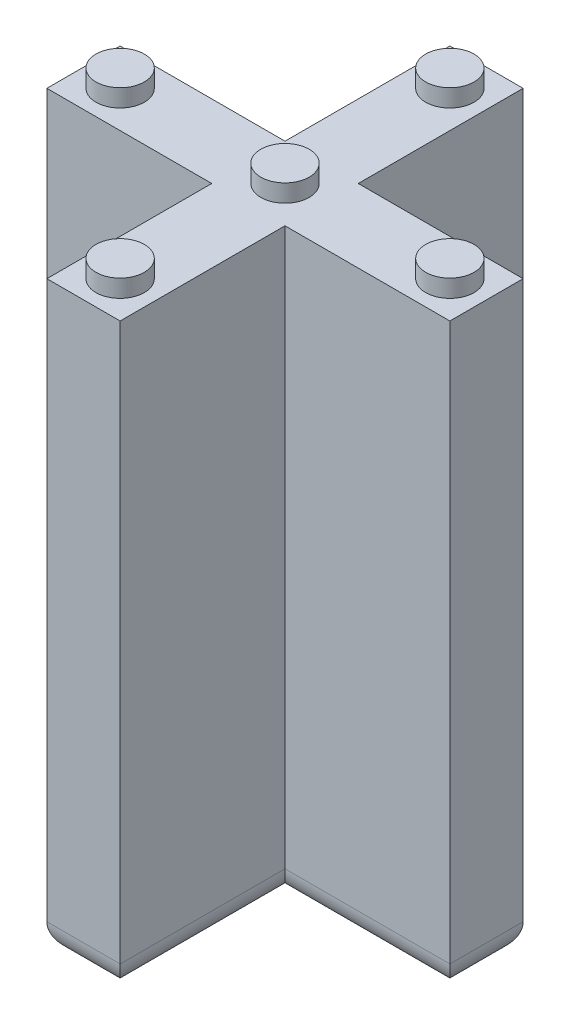
ISO-10303-21;
HEADER;
FILE_DESCRIPTION(('STEP AP214'),'2;1');
FILE_NAME('part.step','',(''),(''),'','','');
FILE_SCHEMA(('AUTOMOTIVE_DESIGN { 1 0 10303 214 1 1 1 1 }'));
ENDSEC;
DATA;
#1=APPLICATION_CONTEXT('core data for automotive mechanical design processes');
#2=APPLICATION_PROTOCOL_DEFINITION('international standard','automotive_design',2000,#1);
#3=PRODUCT_CONTEXT('',#1,'mechanical');
#4=PRODUCT('Part','Part','',(#3));
#5=PRODUCT_RELATED_PRODUCT_CATEGORY('part','',(#4));
#6=PRODUCT_DEFINITION_FORMATION('','',#4);
#7=PRODUCT_DEFINITION_CONTEXT('part definition',#1,'design');
#8=PRODUCT_DEFINITION('design','',#6,#7);
#9=PRODUCT_DEFINITION_SHAPE('','',#8);
#10=(LENGTH_UNIT() NAMED_UNIT(*) SI_UNIT(.MILLI.,.METRE.));
#11=(NAMED_UNIT(*) PLANE_ANGLE_UNIT() SI_UNIT($,.RADIAN.));
#12=(NAMED_UNIT(*) SI_UNIT($,.STERADIAN.) SOLID_ANGLE_UNIT());
#13=UNCERTAINTY_MEASURE_WITH_UNIT(LENGTH_MEASURE(1.E-05),#10,'distance_accuracy_value','');
#14=(GEOMETRIC_REPRESENTATION_CONTEXT(3) GLOBAL_UNCERTAINTY_ASSIGNED_CONTEXT((#13)) GLOBAL_UNIT_ASSIGNED_CONTEXT((#10,
#11,#12)) REPRESENTATION_CONTEXT('',''));
#15=CARTESIAN_POINT('',(0.,0.,0.));
#16=DIRECTION('',(0.,0.,1.));
#17=DIRECTION('',(1.,0.,0.));
#18=AXIS2_PLACEMENT_3D('',#15,#16,#17);
#19=CARTESIAN_POINT('',(0.,40.,-2.5));
#20=DIRECTION('',(0.,0.,-1.));
#21=DIRECTION('',(-1.,0.,0.));
#22=AXIS2_PLACEMENT_3D('',#19,#20,#21);
#23=PLANE('',#22);
#24=DIRECTION('',(0.,-1.,0.));
#25=VECTOR('',#24,1.);
#26=CARTESIAN_POINT('',(13.75,40.,-2.5));
#27=LINE('',#26,#25);
#28=CARTESIAN_POINT('',(13.75,40.,-2.5));
#29=VERTEX_POINT('',#28);
#30=CARTESIAN_POINT('',(13.75,2.,-2.5));
#31=VERTEX_POINT('',#30);
#32=EDGE_CURVE('E215',#29,#31,#27,.T.);
#33=ORIENTED_EDGE('',*,*,#32,.T.);
#34=DIRECTION('',(1.,0.,0.));
#35=VECTOR('',#34,1.);
#36=CARTESIAN_POINT('',(2.5,2.,-2.5));
#37=LINE('',#36,#35);
#38=CARTESIAN_POINT('',(2.5,2.,-2.5));
#39=VERTEX_POINT('',#38);
#40=EDGE_CURVE('E11',#31,#39,#37,.F.);
#41=ORIENTED_EDGE('',*,*,#40,.T.);
#42=DIRECTION('',(0.,-1.,0.));
#43=VECTOR('',#42,1.);
#44=CARTESIAN_POINT('',(2.5,40.,-2.5));
#45=LINE('',#44,#43);
#46=CARTESIAN_POINT('',(2.5,40.,-2.5));
#47=VERTEX_POINT('',#46);
#48=EDGE_CURVE('E163',#47,#39,#45,.T.);
#49=ORIENTED_EDGE('',*,*,#48,.F.);
#50=DIRECTION('',(1.,0.,0.));
#51=VECTOR('',#50,1.);
#52=CARTESIAN_POINT('',(0.,40.,-2.5));
#53=LINE('',#52,#51);
#54=EDGE_CURVE('E166',#47,#29,#53,.T.);
#55=ORIENTED_EDGE('',*,*,#54,.T.);
#56=EDGE_LOOP('',(#33,#41,#49,#55));
#57=FACE_BOUND('',#56,.T.);
#58=ADVANCED_FACE('F35',(#57),#23,.T.);
#59=CARTESIAN_POINT('',(2.5,40.,0.));
#60=DIRECTION('',(-1.,0.,0.));
#61=DIRECTION('',(0.,0.,1.));
#62=AXIS2_PLACEMENT_3D('',#59,#60,#61);
#63=PLANE('',#62);
#64=ORIENTED_EDGE('',*,*,#48,.T.);
#65=DIRECTION('',(0.,0.,-1.));
#66=VECTOR('',#65,1.);
#67=CARTESIAN_POINT('',(2.5,2.,0.));
#68=LINE('',#67,#66);
#69=CARTESIAN_POINT('',(2.5,2.,-13.75));
#70=VERTEX_POINT('',#69);
#71=EDGE_CURVE('E248',#39,#70,#68,.T.);
#72=ORIENTED_EDGE('',*,*,#71,.T.);
#73=DIRECTION('',(0.,-1.,0.));
#74=VECTOR('',#73,1.);
#75=CARTESIAN_POINT('',(2.5,40.,-13.75));
#76=LINE('',#75,#74);
#77=CARTESIAN_POINT('',(2.5,40.,-13.75));
#78=VERTEX_POINT('',#77);
#79=EDGE_CURVE('E172',#78,#70,#76,.T.);
#80=ORIENTED_EDGE('',*,*,#79,.F.);
#81=DIRECTION('',(0.,0.,-1.));
#82=VECTOR('',#81,1.);
#83=CARTESIAN_POINT('',(2.5,40.,0.));
#84=LINE('',#83,#82);
#85=EDGE_CURVE('E175',#47,#78,#84,.T.);
#86=ORIENTED_EDGE('',*,*,#85,.F.);
#87=EDGE_LOOP('',(#64,#72,#80,#86));
#88=FACE_BOUND('',#87,.T.);
#89=ADVANCED_FACE('F176',(#88),#63,.F.);
#90=CARTESIAN_POINT('',(0.,40.,-13.75));
#91=DIRECTION('',(0.,0.,-1.));
#92=DIRECTION('',(-1.,0.,0.));
#93=AXIS2_PLACEMENT_3D('',#90,#91,#92);
#94=PLANE('',#93);
#95=ORIENTED_EDGE('',*,*,#79,.T.);
#96=DIRECTION('',(1.,0.,0.));
#97=VECTOR('',#96,1.);
#98=CARTESIAN_POINT('',(-2.5,2.,-13.75));
#99=LINE('',#98,#97);
#100=CARTESIAN_POINT('',(-2.5,2.,-13.75));
#101=VERTEX_POINT('',#100);
#102=EDGE_CURVE('E275',#70,#101,#99,.F.);
#103=ORIENTED_EDGE('',*,*,#102,.T.);
#104=DIRECTION('',(0.,-1.,0.));
#105=VECTOR('',#104,1.);
#106=CARTESIAN_POINT('',(-2.5,40.,-13.75));
#107=LINE('',#106,#105);
#108=CARTESIAN_POINT('',(-2.5,40.,-13.75));
#109=VERTEX_POINT('',#108);
#110=EDGE_CURVE('E239',#109,#101,#107,.T.);
#111=ORIENTED_EDGE('',*,*,#110,.F.);
#112=DIRECTION('',(1.,0.,0.));
#113=VECTOR('',#112,1.);
#114=CARTESIAN_POINT('',(0.,40.,-13.75));
#115=LINE('',#114,#113);
#116=EDGE_CURVE('E181',#109,#78,#115,.T.);
#117=ORIENTED_EDGE('',*,*,#116,.T.);
#118=EDGE_LOOP('',(#95,#103,#111,#117));
#119=FACE_BOUND('',#118,.T.);
#120=ADVANCED_FACE('F384',(#119),#94,.T.);
#121=CARTESIAN_POINT('',(-2.5,40.,0.));
#122=DIRECTION('',(-1.,0.,0.));
#123=DIRECTION('',(0.,0.,1.));
#124=AXIS2_PLACEMENT_3D('',#121,#122,#123);
#125=PLANE('',#124);
#126=ORIENTED_EDGE('',*,*,#110,.T.);
#127=DIRECTION('',(0.,0.,-1.));
#128=VECTOR('',#127,1.);
#129=CARTESIAN_POINT('',(-2.5,2.,-2.5));
#130=LINE('',#129,#128);
#131=CARTESIAN_POINT('',(-2.5,2.,-2.5));
#132=VERTEX_POINT('',#131);
#133=EDGE_CURVE('E277',#101,#132,#130,.F.);
#134=ORIENTED_EDGE('',*,*,#133,.T.);
#135=DIRECTION('',(0.,-1.,0.));
#136=VECTOR('',#135,1.);
#137=CARTESIAN_POINT('',(-2.5,40.,-2.5));
#138=LINE('',#137,#136);
#139=CARTESIAN_POINT('',(-2.5,40.,-2.5));
#140=VERTEX_POINT('',#139);
#141=EDGE_CURVE('E236',#140,#132,#138,.T.);
#142=ORIENTED_EDGE('',*,*,#141,.F.);
#143=DIRECTION('',(0.,0.,-1.));
#144=VECTOR('',#143,1.);
#145=CARTESIAN_POINT('',(-2.5,40.,0.));
#146=LINE('',#145,#144);
#147=EDGE_CURVE('E194',#140,#109,#146,.T.);
#148=ORIENTED_EDGE('',*,*,#147,.T.);
#149=EDGE_LOOP('',(#126,#134,#142,#148));
#150=FACE_BOUND('',#149,.T.);
#151=ADVANCED_FACE('F487',(#150),#125,.T.);
#152=CARTESIAN_POINT('',(0.,40.,-2.5));
#153=DIRECTION('',(0.,0.,-1.));
#154=DIRECTION('',(-1.,0.,0.));
#155=AXIS2_PLACEMENT_3D('',#152,#153,#154);
#156=PLANE('',#155);
#157=ORIENTED_EDGE('',*,*,#141,.T.);
#158=DIRECTION('',(1.,0.,0.));
#159=VECTOR('',#158,1.);
#160=CARTESIAN_POINT('',(-13.75,2.,-2.5));
#161=LINE('',#160,#159);
#162=CARTESIAN_POINT('',(-13.75,2.,-2.5));
#163=VERTEX_POINT('',#162);
#164=EDGE_CURVE('E279',#132,#163,#161,.F.);
#165=ORIENTED_EDGE('',*,*,#164,.T.);
#166=DIRECTION('',(0.,-1.,0.));
#167=VECTOR('',#166,1.);
#168=CARTESIAN_POINT('',(-13.75,40.,-2.5));
#169=LINE('',#168,#167);
#170=CARTESIAN_POINT('',(-13.75,40.,-2.5));
#171=VERTEX_POINT('',#170);
#172=EDGE_CURVE('E233',#171,#163,#169,.T.);
#173=ORIENTED_EDGE('',*,*,#172,.F.);
#174=DIRECTION('',(1.,0.,0.));
#175=VECTOR('',#174,1.);
#176=CARTESIAN_POINT('',(0.,40.,-2.5));
#177=LINE('',#176,#175);
#178=EDGE_CURVE('E197',#171,#140,#177,.T.);
#179=ORIENTED_EDGE('',*,*,#178,.T.);
#180=EDGE_LOOP('',(#157,#165,#173,#179));
#181=FACE_BOUND('',#180,.T.);
#182=ADVANCED_FACE('F489',(#181),#156,.T.);
#183=CARTESIAN_POINT('',(-13.75,40.,0.));
#184=DIRECTION('',(-1.,0.,0.));
#185=DIRECTION('',(0.,0.,1.));
#186=AXIS2_PLACEMENT_3D('',#183,#184,#185);
#187=PLANE('',#186);
#188=ORIENTED_EDGE('',*,*,#172,.T.);
#189=DIRECTION('',(0.,0.,-1.));
#190=VECTOR('',#189,1.);
#191=CARTESIAN_POINT('',(-13.75,2.,2.5));
#192=LINE('',#191,#190);
#193=CARTESIAN_POINT('',(-13.75,2.,2.5));
#194=VERTEX_POINT('',#193);
#195=EDGE_CURVE('E281',#163,#194,#192,.F.);
#196=ORIENTED_EDGE('',*,*,#195,.T.);
#197=DIRECTION('',(0.,-1.,0.));
#198=VECTOR('',#197,1.);
#199=CARTESIAN_POINT('',(-13.75,40.,2.5));
#200=LINE('',#199,#198);
#201=CARTESIAN_POINT('',(-13.75,40.,2.5));
#202=VERTEX_POINT('',#201);
#203=EDGE_CURVE('E230',#202,#194,#200,.T.);
#204=ORIENTED_EDGE('',*,*,#203,.F.);
#205=DIRECTION('',(0.,0.,-1.));
#206=VECTOR('',#205,1.);
#207=CARTESIAN_POINT('',(-13.75,40.,0.));
#208=LINE('',#207,#206);
#209=EDGE_CURVE('E200',#202,#171,#208,.T.);
#210=ORIENTED_EDGE('',*,*,#209,.T.);
#211=EDGE_LOOP('',(#188,#196,#204,#210));
#212=FACE_BOUND('',#211,.T.);
#213=ADVANCED_FACE('F491',(#212),#187,.T.);
#214=CARTESIAN_POINT('',(0.,40.,2.5));
#215=DIRECTION('',(0.,0.,-1.));
#216=DIRECTION('',(-1.,0.,0.));
#217=AXIS2_PLACEMENT_3D('',#214,#215,#216);
#218=PLANE('',#217);
#219=ORIENTED_EDGE('',*,*,#203,.T.);
#220=DIRECTION('',(1.,0.,0.));
#221=VECTOR('',#220,1.);
#222=CARTESIAN_POINT('',(0.,2.,2.5));
#223=LINE('',#222,#221);
#224=CARTESIAN_POINT('',(-2.5,2.,2.5));
#225=VERTEX_POINT('',#224);
#226=EDGE_CURVE('E283',#194,#225,#223,.T.);
#227=ORIENTED_EDGE('',*,*,#226,.T.);
#228=DIRECTION('',(0.,-1.,0.));
#229=VECTOR('',#228,1.);
#230=CARTESIAN_POINT('',(-2.5,40.,2.5));
#231=LINE('',#230,#229);
#232=CARTESIAN_POINT('',(-2.5,40.,2.5));
#233=VERTEX_POINT('',#232);
#234=EDGE_CURVE('E227',#233,#225,#231,.T.);
#235=ORIENTED_EDGE('',*,*,#234,.F.);
#236=DIRECTION('',(1.,0.,0.));
#237=VECTOR('',#236,1.);
#238=CARTESIAN_POINT('',(0.,40.,2.5));
#239=LINE('',#238,#237);
#240=EDGE_CURVE('E203',#202,#233,#239,.T.);
#241=ORIENTED_EDGE('',*,*,#240,.F.);
#242=EDGE_LOOP('',(#219,#227,#235,#241));
#243=FACE_BOUND('',#242,.T.);
#244=ADVANCED_FACE('F464',(#243),#218,.F.);
#245=CARTESIAN_POINT('',(-2.5,40.,0.));
#246=DIRECTION('',(-1.,0.,0.));
#247=DIRECTION('',(0.,0.,1.));
#248=AXIS2_PLACEMENT_3D('',#245,#246,#247);
#249=PLANE('',#248);
#250=ORIENTED_EDGE('',*,*,#234,.T.);
#251=DIRECTION('',(0.,0.,-1.));
#252=VECTOR('',#251,1.);
#253=CARTESIAN_POINT('',(-2.5,2.,13.75));
#254=LINE('',#253,#252);
#255=CARTESIAN_POINT('',(-2.5,2.,13.75));
#256=VERTEX_POINT('',#255);
#257=EDGE_CURVE('E285',#225,#256,#254,.F.);
#258=ORIENTED_EDGE('',*,*,#257,.T.);
#259=DIRECTION('',(0.,-1.,0.));
#260=VECTOR('',#259,1.);
#261=CARTESIAN_POINT('',(-2.5,40.,13.75));
#262=LINE('',#261,#260);
#263=CARTESIAN_POINT('',(-2.5,40.,13.75));
#264=VERTEX_POINT('',#263);
#265=EDGE_CURVE('E224',#264,#256,#262,.T.);
#266=ORIENTED_EDGE('',*,*,#265,.F.);
#267=DIRECTION('',(0.,0.,-1.));
#268=VECTOR('',#267,1.);
#269=CARTESIAN_POINT('',(-2.5,40.,0.));
#270=LINE('',#269,#268);
#271=EDGE_CURVE('E205',#264,#233,#270,.T.);
#272=ORIENTED_EDGE('',*,*,#271,.T.);
#273=EDGE_LOOP('',(#250,#258,#266,#272));
#274=FACE_BOUND('',#273,.T.);
#275=ADVANCED_FACE('F460',(#274),#249,.T.);
#276=CARTESIAN_POINT('',(0.,40.,13.75));
#277=DIRECTION('',(0.,0.,-1.));
#278=DIRECTION('',(-1.,0.,0.));
#279=AXIS2_PLACEMENT_3D('',#276,#277,#278);
#280=PLANE('',#279);
#281=ORIENTED_EDGE('',*,*,#265,.T.);
#282=DIRECTION('',(1.,0.,0.));
#283=VECTOR('',#282,1.);
#284=CARTESIAN_POINT('',(0.,2.,13.75));
#285=LINE('',#284,#283);
#286=CARTESIAN_POINT('',(2.5,2.,13.75));
#287=VERTEX_POINT('',#286);
#288=EDGE_CURVE('E287',#256,#287,#285,.T.);
#289=ORIENTED_EDGE('',*,*,#288,.T.);
#290=DIRECTION('',(0.,-1.,0.));
#291=VECTOR('',#290,1.);
#292=CARTESIAN_POINT('',(2.5,40.,13.75));
#293=LINE('',#292,#291);
#294=CARTESIAN_POINT('',(2.5,40.,13.75));
#295=VERTEX_POINT('',#294);
#296=EDGE_CURVE('E221',#295,#287,#293,.T.);
#297=ORIENTED_EDGE('',*,*,#296,.F.);
#298=DIRECTION('',(1.,0.,0.));
#299=VECTOR('',#298,1.);
#300=CARTESIAN_POINT('',(0.,40.,13.75));
#301=LINE('',#300,#299);
#302=EDGE_CURVE('E208',#264,#295,#301,.T.);
#303=ORIENTED_EDGE('',*,*,#302,.F.);
#304=EDGE_LOOP('',(#281,#289,#297,#303));
#305=FACE_BOUND('',#304,.T.);
#306=ADVANCED_FACE('F458',(#305),#280,.F.);
#307=CARTESIAN_POINT('',(2.5,40.,0.));
#308=DIRECTION('',(-1.,0.,0.));
#309=DIRECTION('',(0.,0.,1.));
#310=AXIS2_PLACEMENT_3D('',#307,#308,#309);
#311=PLANE('',#310);
#312=ORIENTED_EDGE('',*,*,#296,.T.);
#313=DIRECTION('',(0.,0.,-1.));
#314=VECTOR('',#313,1.);
#315=CARTESIAN_POINT('',(2.5,2.,0.));
#316=LINE('',#315,#314);
#317=CARTESIAN_POINT('',(2.5,2.,2.5));
#318=VERTEX_POINT('',#317);
#319=EDGE_CURVE('E289',#287,#318,#316,.T.);
#320=ORIENTED_EDGE('',*,*,#319,.T.);
#321=DIRECTION('',(0.,-1.,0.));
#322=VECTOR('',#321,1.);
#323=CARTESIAN_POINT('',(2.5,40.,2.5));
#324=LINE('',#323,#322);
#325=CARTESIAN_POINT('',(2.5,40.,2.5));
#326=VERTEX_POINT('',#325);
#327=EDGE_CURVE('E219',#326,#318,#324,.T.);
#328=ORIENTED_EDGE('',*,*,#327,.F.);
#329=DIRECTION('',(0.,0.,-1.));
#330=VECTOR('',#329,1.);
#331=CARTESIAN_POINT('',(2.5,40.,0.));
#332=LINE('',#331,#330);
#333=EDGE_CURVE('E210',#295,#326,#332,.T.);
#334=ORIENTED_EDGE('',*,*,#333,.F.);
#335=EDGE_LOOP('',(#312,#320,#328,#334));
#336=FACE_BOUND('',#335,.T.);
#337=ADVANCED_FACE('F450',(#336),#311,.F.);
#338=CARTESIAN_POINT('',(0.,40.,2.5));
#339=DIRECTION('',(0.,0.,-1.));
#340=DIRECTION('',(-1.,0.,0.));
#341=AXIS2_PLACEMENT_3D('',#338,#339,#340);
#342=PLANE('',#341);
#343=ORIENTED_EDGE('',*,*,#327,.T.);
#344=DIRECTION('',(1.,0.,0.));
#345=VECTOR('',#344,1.);
#346=CARTESIAN_POINT('',(0.,2.,2.5));
#347=LINE('',#346,#345);
#348=CARTESIAN_POINT('',(13.75,2.,2.5));
#349=VERTEX_POINT('',#348);
#350=EDGE_CURVE('E59',#318,#349,#347,.T.);
#351=ORIENTED_EDGE('',*,*,#350,.T.);
#352=DIRECTION('',(0.,-1.,0.));
#353=VECTOR('',#352,1.);
#354=CARTESIAN_POINT('',(13.75,40.,2.5));
#355=LINE('',#354,#353);
#356=CARTESIAN_POINT('',(13.75,40.,2.5));
#357=VERTEX_POINT('',#356);
#358=EDGE_CURVE('E217',#357,#349,#355,.T.);
#359=ORIENTED_EDGE('',*,*,#358,.F.);
#360=DIRECTION('',(1.,0.,0.));
#361=VECTOR('',#360,1.);
#362=CARTESIAN_POINT('',(0.,40.,2.5));
#363=LINE('',#362,#361);
#364=EDGE_CURVE('E212',#326,#357,#363,.T.);
#365=ORIENTED_EDGE('',*,*,#364,.F.);
#366=EDGE_LOOP('',(#343,#351,#359,#365));
#367=FACE_BOUND('',#366,.T.);
#368=ADVANCED_FACE('F454',(#367),#342,.F.);
#369=CARTESIAN_POINT('',(13.75,40.,0.));
#370=DIRECTION('',(-1.,0.,0.));
#371=DIRECTION('',(0.,0.,1.));
#372=AXIS2_PLACEMENT_3D('',#369,#370,#371);
#373=PLANE('',#372);
#374=ORIENTED_EDGE('',*,*,#358,.T.);
#375=DIRECTION('',(0.,0.,-1.));
#376=VECTOR('',#375,1.);
#377=CARTESIAN_POINT('',(13.75,2.,0.));
#378=LINE('',#377,#376);
#379=EDGE_CURVE('E44',#349,#31,#378,.T.);
#380=ORIENTED_EDGE('',*,*,#379,.T.);
#381=ORIENTED_EDGE('',*,*,#32,.F.);
#382=DIRECTION('',(0.,0.,-1.));
#383=VECTOR('',#382,1.);
#384=CARTESIAN_POINT('',(13.75,40.,0.));
#385=LINE('',#384,#383);
#386=EDGE_CURVE('E185',#357,#29,#385,.T.);
#387=ORIENTED_EDGE('',*,*,#386,.F.);
#388=EDGE_LOOP('',(#374,#380,#381,#387));
#389=FACE_BOUND('',#388,.T.);
#390=ADVANCED_FACE('F359',(#389),#373,.F.);
#391=CARTESIAN_POINT('',(0.,40.,0.));
#392=DIRECTION('',(0.,1.,0.));
#393=DIRECTION('',(0.,0.,1.));
#394=AXIS2_PLACEMENT_3D('',#391,#392,#393);
#395=PLANE('',#394);
#396=CARTESIAN_POINT('',(0.,40.,11.25));
#397=DIRECTION('',(0.,1.,0.));
#398=DIRECTION('',(0.,0.,1.));
#399=AXIS2_PLACEMENT_3D('',#396,#397,#398);
#400=CIRCLE('',#399,1.65);
#401=CARTESIAN_POINT('',(0.,40.,12.9));
#402=VERTEX_POINT('',#401);
#403=EDGE_CURVE('E245',#402,#402,#400,.T.);
#404=ORIENTED_EDGE('',*,*,#403,.F.);
#405=EDGE_LOOP('',(#404));
#406=FACE_BOUND('',#405,.T.);
#407=CARTESIAN_POINT('',(11.25,40.,0.));
#408=DIRECTION('',(0.,1.,0.));
#409=DIRECTION('',(0.,0.,1.));
#410=AXIS2_PLACEMENT_3D('',#407,#408,#409);
#411=CIRCLE('',#410,1.65);
#412=CARTESIAN_POINT('',(11.25,40.,1.65));
#413=VERTEX_POINT('',#412);
#414=EDGE_CURVE('E333',#413,#413,#411,.T.);
#415=ORIENTED_EDGE('',*,*,#414,.F.);
#416=EDGE_LOOP('',(#415));
#417=FACE_BOUND('',#416,.T.);
#418=CARTESIAN_POINT('',(0.,40.,-11.25));
#419=DIRECTION('',(0.,1.,0.));
#420=DIRECTION('',(0.,0.,1.));
#421=AXIS2_PLACEMENT_3D('',#418,#419,#420);
#422=CIRCLE('',#421,1.65);
#423=CARTESIAN_POINT('',(0.,40.,-9.6));
#424=VERTEX_POINT('',#423);
#425=EDGE_CURVE('E342',#424,#424,#422,.T.);
#426=ORIENTED_EDGE('',*,*,#425,.F.);
#427=EDGE_LOOP('',(#426));
#428=FACE_BOUND('',#427,.T.);
#429=CARTESIAN_POINT('',(0.,40.,0.));
#430=DIRECTION('',(0.,1.,0.));
#431=DIRECTION('',(0.,0.,1.));
#432=AXIS2_PLACEMENT_3D('',#429,#430,#431);
#433=CIRCLE('',#432,1.65);
#434=CARTESIAN_POINT('',(0.,40.,1.65));
#435=VERTEX_POINT('',#434);
#436=EDGE_CURVE('E347',#435,#435,#433,.T.);
#437=ORIENTED_EDGE('',*,*,#436,.F.);
#438=EDGE_LOOP('',(#437));
#439=FACE_BOUND('',#438,.T.);
#440=CARTESIAN_POINT('',(-11.25,40.,0.));
#441=DIRECTION('',(0.,1.,0.));
#442=DIRECTION('',(0.,0.,1.));
#443=AXIS2_PLACEMENT_3D('',#440,#441,#442);
#444=CIRCLE('',#443,1.65);
#445=CARTESIAN_POINT('',(-11.25,40.,1.65));
#446=VERTEX_POINT('',#445);
#447=EDGE_CURVE('E171',#446,#446,#444,.T.);
#448=ORIENTED_EDGE('',*,*,#447,.F.);
#449=EDGE_LOOP('',(#448));
#450=FACE_BOUND('',#449,.T.);
#451=ORIENTED_EDGE('',*,*,#54,.F.);
#452=ORIENTED_EDGE('',*,*,#85,.T.);
#453=ORIENTED_EDGE('',*,*,#116,.F.);
#454=ORIENTED_EDGE('',*,*,#147,.F.);
#455=ORIENTED_EDGE('',*,*,#178,.F.);
#456=ORIENTED_EDGE('',*,*,#209,.F.);
#457=ORIENTED_EDGE('',*,*,#240,.T.);
#458=ORIENTED_EDGE('',*,*,#271,.F.);
#459=ORIENTED_EDGE('',*,*,#302,.T.);
#460=ORIENTED_EDGE('',*,*,#333,.T.);
#461=ORIENTED_EDGE('',*,*,#364,.T.);
#462=ORIENTED_EDGE('',*,*,#386,.T.);
#463=EDGE_LOOP('',(#451,#452,#453,#454,#455,#456,#457,#458,#459,#460,#461,#462));
#464=FACE_BOUND('',#463,.T.);
#465=ADVANCED_FACE('F183',(#406,#417,#428,#439,#450,#464),#395,.T.);
#466=CARTESIAN_POINT('',(0.,0.,0.));
#467=DIRECTION('',(0.,1.,0.));
#468=DIRECTION('',(0.,0.,1.));
#469=AXIS2_PLACEMENT_3D('',#466,#467,#468);
#470=PLANE('',#469);
#471=DIRECTION('',(1.,0.,0.));
#472=VECTOR('',#471,1.);
#473=CARTESIAN_POINT('',(2.5,0.,-11.75));
#474=LINE('',#473,#472);
#475=CARTESIAN_POINT('',(-0.499999999999999,0.,-11.75));
#476=VERTEX_POINT('',#475);
#477=CARTESIAN_POINT('',(0.500000000000001,0.,-11.75));
#478=VERTEX_POINT('',#477);
#479=EDGE_CURVE('E270',#476,#478,#474,.T.);
#480=ORIENTED_EDGE('',*,*,#479,.T.);
#481=DIRECTION('',(0.,0.,-1.));
#482=VECTOR('',#481,1.);
#483=CARTESIAN_POINT('',(0.500000000000001,0.,0.));
#484=LINE('',#483,#482);
#485=CARTESIAN_POINT('',(0.500000000000001,0.,-0.5));
#486=VERTEX_POINT('',#485);
#487=EDGE_CURVE('E272',#478,#486,#484,.F.);
#488=ORIENTED_EDGE('',*,*,#487,.T.);
#489=DIRECTION('',(1.,0.,0.));
#490=VECTOR('',#489,1.);
#491=CARTESIAN_POINT('',(13.75,0.,-0.5));
#492=LINE('',#491,#490);
#493=CARTESIAN_POINT('',(11.75,0.,-0.5));
#494=VERTEX_POINT('',#493);
#495=EDGE_CURVE('E250',#486,#494,#492,.T.);
#496=ORIENTED_EDGE('',*,*,#495,.T.);
#497=DIRECTION('',(0.,0.,-1.));
#498=VECTOR('',#497,1.);
#499=CARTESIAN_POINT('',(11.75,0.,0.));
#500=LINE('',#499,#498);
#501=CARTESIAN_POINT('',(11.75,0.,0.499999999999999));
#502=VERTEX_POINT('',#501);
#503=EDGE_CURVE('E252',#494,#502,#500,.F.);
#504=ORIENTED_EDGE('',*,*,#503,.T.);
#505=DIRECTION('',(1.,0.,0.));
#506=VECTOR('',#505,1.);
#507=CARTESIAN_POINT('',(0.,0.,0.499999999999997));
#508=LINE('',#507,#506);
#509=CARTESIAN_POINT('',(0.500000000000001,0.,0.499999999999997));
#510=VERTEX_POINT('',#509);
#511=EDGE_CURVE('E254',#502,#510,#508,.F.);
#512=ORIENTED_EDGE('',*,*,#511,.T.);
#513=DIRECTION('',(0.,0.,-1.));
#514=VECTOR('',#513,1.);
#515=CARTESIAN_POINT('',(0.500000000000001,0.,0.));
#516=LINE('',#515,#514);
#517=CARTESIAN_POINT('',(0.500000000000001,0.,11.75));
#518=VERTEX_POINT('',#517);
#519=EDGE_CURVE('E256',#510,#518,#516,.F.);
#520=ORIENTED_EDGE('',*,*,#519,.T.);
#521=DIRECTION('',(1.,0.,0.));
#522=VECTOR('',#521,1.);
#523=CARTESIAN_POINT('',(0.,0.,11.75));
#524=LINE('',#523,#522);
#525=CARTESIAN_POINT('',(-0.499999999999999,0.,11.75));
#526=VERTEX_POINT('',#525);
#527=EDGE_CURVE('E258',#518,#526,#524,.F.);
#528=ORIENTED_EDGE('',*,*,#527,.T.);
#529=DIRECTION('',(0.,0.,-1.));
#530=VECTOR('',#529,1.);
#531=CARTESIAN_POINT('',(-0.499999999999999,0.,2.5));
#532=LINE('',#531,#530);
#533=CARTESIAN_POINT('',(-0.499999999999999,0.,0.5));
#534=VERTEX_POINT('',#533);
#535=EDGE_CURVE('E260',#526,#534,#532,.T.);
#536=ORIENTED_EDGE('',*,*,#535,.T.);
#537=DIRECTION('',(1.,0.,0.));
#538=VECTOR('',#537,1.);
#539=CARTESIAN_POINT('',(0.,0.,0.5));
#540=LINE('',#539,#538);
#541=CARTESIAN_POINT('',(-11.75,0.,0.499999999999999));
#542=VERTEX_POINT('',#541);
#543=EDGE_CURVE('E262',#534,#542,#540,.F.);
#544=ORIENTED_EDGE('',*,*,#543,.T.);
#545=DIRECTION('',(0.,0.,-1.));
#546=VECTOR('',#545,1.);
#547=CARTESIAN_POINT('',(-11.75,0.,-2.5));
#548=LINE('',#547,#546);
#549=CARTESIAN_POINT('',(-11.75,0.,-0.5));
#550=VERTEX_POINT('',#549);
#551=EDGE_CURVE('E264',#542,#550,#548,.T.);
#552=ORIENTED_EDGE('',*,*,#551,.T.);
#553=DIRECTION('',(1.,0.,0.));
#554=VECTOR('',#553,1.);
#555=CARTESIAN_POINT('',(-2.5,0.,-0.5));
#556=LINE('',#555,#554);
#557=CARTESIAN_POINT('',(-0.499999999999999,0.,-0.5));
#558=VERTEX_POINT('',#557);
#559=EDGE_CURVE('E266',#550,#558,#556,.T.);
#560=ORIENTED_EDGE('',*,*,#559,.T.);
#561=DIRECTION('',(0.,0.,-1.));
#562=VECTOR('',#561,1.);
#563=CARTESIAN_POINT('',(-0.499999999999999,0.,-13.75));
#564=LINE('',#563,#562);
#565=EDGE_CURVE('E268',#558,#476,#564,.T.);
#566=ORIENTED_EDGE('',*,*,#565,.T.);
#567=EDGE_LOOP('',(#480,#488,#496,#504,#512,#520,#528,#536,#544,#552,#560,#566));
#568=FACE_BOUND('',#567,.T.);
#569=ADVANCED_FACE('F358',(#568),#470,.F.);
#570=CARTESIAN_POINT('',(-11.25,41.2,0.));
#571=DIRECTION('',(0.,-1.,0.));
#572=DIRECTION('',(0.,0.,-1.));
#573=AXIS2_PLACEMENT_3D('',#570,#571,#572);
#574=CYLINDRICAL_SURFACE('',#573,1.65);
#575=CARTESIAN_POINT('',(-11.25,41.2,0.));
#576=DIRECTION('',(0.,1.,0.));
#577=DIRECTION('',(0.,0.,1.));
#578=AXIS2_PLACEMENT_3D('',#575,#576,#577);
#579=CIRCLE('',#578,1.65);
#580=CARTESIAN_POINT('',(-11.25,41.2,1.65));
#581=VERTEX_POINT('',#580);
#582=EDGE_CURVE('E186',#581,#581,#579,.F.);
#583=ORIENTED_EDGE('',*,*,#582,.T.);
#584=EDGE_LOOP('',(#583));
#585=FACE_BOUND('',#584,.T.);
#586=ORIENTED_EDGE('',*,*,#447,.T.);
#587=EDGE_LOOP('',(#586));
#588=FACE_BOUND('',#587,.T.);
#589=ADVANCED_FACE('F364',(#585,#588),#574,.T.);
#590=CARTESIAN_POINT('',(0.,41.2,0.));
#591=DIRECTION('',(0.,1.,0.));
#592=DIRECTION('',(0.,0.,1.));
#593=AXIS2_PLACEMENT_3D('',#590,#591,#592);
#594=PLANE('',#593);
#595=ORIENTED_EDGE('',*,*,#582,.F.);
#596=EDGE_LOOP('',(#595));
#597=FACE_BOUND('',#596,.T.);
#598=ADVANCED_FACE('F366',(#597),#594,.T.);
#599=CARTESIAN_POINT('',(0.,41.2,0.));
#600=DIRECTION('',(0.,-1.,0.));
#601=DIRECTION('',(0.,0.,-1.));
#602=AXIS2_PLACEMENT_3D('',#599,#600,#601);
#603=CYLINDRICAL_SURFACE('',#602,1.65);
#604=CARTESIAN_POINT('',(0.,41.2,0.));
#605=DIRECTION('',(0.,1.,0.));
#606=DIRECTION('',(0.,0.,1.));
#607=AXIS2_PLACEMENT_3D('',#604,#605,#606);
#608=CIRCLE('',#607,1.65);
#609=CARTESIAN_POINT('',(0.,41.2,1.65));
#610=VERTEX_POINT('',#609);
#611=EDGE_CURVE('E189',#610,#610,#608,.T.);
#612=ORIENTED_EDGE('',*,*,#611,.F.);
#613=EDGE_LOOP('',(#612));
#614=FACE_BOUND('',#613,.T.);
#615=ORIENTED_EDGE('',*,*,#436,.T.);
#616=EDGE_LOOP('',(#615));
#617=FACE_BOUND('',#616,.T.);
#618=ADVANCED_FACE('F354',(#614,#617),#603,.T.);
#619=CARTESIAN_POINT('',(0.,41.2,0.));
#620=DIRECTION('',(0.,1.,0.));
#621=DIRECTION('',(0.,0.,1.));
#622=AXIS2_PLACEMENT_3D('',#619,#620,#621);
#623=PLANE('',#622);
#624=ORIENTED_EDGE('',*,*,#611,.T.);
#625=EDGE_LOOP('',(#624));
#626=FACE_BOUND('',#625,.T.);
#627=ADVANCED_FACE('F694',(#626),#623,.T.);
#628=CARTESIAN_POINT('',(0.,41.2,-11.25));
#629=DIRECTION('',(0.,-1.,0.));
#630=DIRECTION('',(0.,0.,-1.));
#631=AXIS2_PLACEMENT_3D('',#628,#629,#630);
#632=CYLINDRICAL_SURFACE('',#631,1.65);
#633=CARTESIAN_POINT('',(0.,41.2,-11.25));
#634=DIRECTION('',(0.,1.,0.));
#635=DIRECTION('',(0.,0.,1.));
#636=AXIS2_PLACEMENT_3D('',#633,#634,#635);
#637=CIRCLE('',#636,1.65);
#638=CARTESIAN_POINT('',(0.,41.2,-9.6));
#639=VERTEX_POINT('',#638);
#640=EDGE_CURVE('E344',#639,#639,#637,.T.);
#641=ORIENTED_EDGE('',*,*,#640,.F.);
#642=EDGE_LOOP('',(#641));
#643=FACE_BOUND('',#642,.T.);
#644=ORIENTED_EDGE('',*,*,#425,.T.);
#645=EDGE_LOOP('',(#644));
#646=FACE_BOUND('',#645,.T.);
#647=ADVANCED_FACE('F685',(#643,#646),#632,.T.);
#648=CARTESIAN_POINT('',(0.,41.2,0.));
#649=DIRECTION('',(0.,1.,0.));
#650=DIRECTION('',(0.,0.,1.));
#651=AXIS2_PLACEMENT_3D('',#648,#649,#650);
#652=PLANE('',#651);
#653=ORIENTED_EDGE('',*,*,#640,.T.);
#654=EDGE_LOOP('',(#653));
#655=FACE_BOUND('',#654,.T.);
#656=ADVANCED_FACE('F676',(#655),#652,.T.);
#657=CARTESIAN_POINT('',(11.25,41.2,0.));
#658=DIRECTION('',(0.,-1.,0.));
#659=DIRECTION('',(0.,0.,-1.));
#660=AXIS2_PLACEMENT_3D('',#657,#658,#659);
#661=CYLINDRICAL_SURFACE('',#660,1.65);
#662=CARTESIAN_POINT('',(11.25,41.2,0.));
#663=DIRECTION('',(0.,1.,0.));
#664=DIRECTION('',(0.,0.,1.));
#665=AXIS2_PLACEMENT_3D('',#662,#663,#664);
#666=CIRCLE('',#665,1.65);
#667=CARTESIAN_POINT('',(11.25,41.2,1.65));
#668=VERTEX_POINT('',#667);
#669=EDGE_CURVE('E338',#668,#668,#666,.T.);
#670=ORIENTED_EDGE('',*,*,#669,.F.);
#671=EDGE_LOOP('',(#670));
#672=FACE_BOUND('',#671,.T.);
#673=ORIENTED_EDGE('',*,*,#414,.T.);
#674=EDGE_LOOP('',(#673));
#675=FACE_BOUND('',#674,.T.);
#676=ADVANCED_FACE('F667',(#672,#675),#661,.T.);
#677=CARTESIAN_POINT('',(0.,41.2,0.));
#678=DIRECTION('',(0.,1.,0.));
#679=DIRECTION('',(0.,0.,1.));
#680=AXIS2_PLACEMENT_3D('',#677,#678,#679);
#681=PLANE('',#680);
#682=ORIENTED_EDGE('',*,*,#669,.T.);
#683=EDGE_LOOP('',(#682));
#684=FACE_BOUND('',#683,.T.);
#685=ADVANCED_FACE('F659',(#684),#681,.T.);
#686=CARTESIAN_POINT('',(0.,41.2,11.25));
#687=DIRECTION('',(0.,-1.,0.));
#688=DIRECTION('',(0.,0.,-1.));
#689=AXIS2_PLACEMENT_3D('',#686,#687,#688);
#690=CYLINDRICAL_SURFACE('',#689,1.65);
#691=CARTESIAN_POINT('',(0.,41.2,11.25));
#692=DIRECTION('',(0.,1.,0.));
#693=DIRECTION('',(0.,0.,1.));
#694=AXIS2_PLACEMENT_3D('',#691,#692,#693);
#695=CIRCLE('',#694,1.65);
#696=CARTESIAN_POINT('',(0.,41.2,12.9));
#697=VERTEX_POINT('',#696);
#698=EDGE_CURVE('E327',#697,#697,#695,.F.);
#699=ORIENTED_EDGE('',*,*,#698,.T.);
#700=EDGE_LOOP('',(#699));
#701=FACE_BOUND('',#700,.T.);
#702=ORIENTED_EDGE('',*,*,#403,.T.);
#703=EDGE_LOOP('',(#702));
#704=FACE_BOUND('',#703,.T.);
#705=ADVANCED_FACE('F436',(#701,#704),#690,.T.);
#706=CARTESIAN_POINT('',(0.,41.2,0.));
#707=DIRECTION('',(0.,1.,0.));
#708=DIRECTION('',(0.,0.,1.));
#709=AXIS2_PLACEMENT_3D('',#706,#707,#708);
#710=PLANE('',#709);
#711=ORIENTED_EDGE('',*,*,#698,.F.);
#712=EDGE_LOOP('',(#711));
#713=FACE_BOUND('',#712,.T.);
#714=ADVANCED_FACE('F431',(#713),#710,.T.);
#715=CARTESIAN_POINT('',(-0.499999999999999,2.,0.));
#716=DIRECTION('',(0.,0.,1.));
#717=DIRECTION('',(1.,0.,0.));
#718=AXIS2_PLACEMENT_3D('',#715,#716,#717);
#719=CYLINDRICAL_SURFACE('',#718,2.);
#720=CARTESIAN_POINT('',(-0.499999999999999,2.,0.5));
#721=DIRECTION('',(0.707106781186547,0.,0.707106781186547));
#722=DIRECTION('',(0.707106781186548,0.,-0.707106781186547));
#723=AXIS2_PLACEMENT_3D('',#720,#721,#722);
#724=ELLIPSE('',#723,2.82842712474619,2.);
#725=EDGE_CURVE('E320',#534,#225,#724,.F.);
#726=ORIENTED_EDGE('',*,*,#725,.F.);
#727=ORIENTED_EDGE('',*,*,#535,.F.);
#728=CARTESIAN_POINT('',(-0.499999999999999,2.,11.75));
#729=DIRECTION('',(0.707106781186547,0.,0.707106781186547));
#730=DIRECTION('',(0.707106781186547,0.,-0.707106781186547));
#731=AXIS2_PLACEMENT_3D('',#728,#729,#730);
#732=ELLIPSE('',#731,2.82842712474619,2.);
#733=EDGE_CURVE('E39',#256,#526,#732,.T.);
#734=ORIENTED_EDGE('',*,*,#733,.F.);
#735=ORIENTED_EDGE('',*,*,#257,.F.);
#736=EDGE_LOOP('',(#726,#727,#734,#735));
#737=FACE_BOUND('',#736,.T.);
#738=ADVANCED_FACE('F37',(#737),#719,.T.);
#739=CARTESIAN_POINT('',(0.,2.,11.75));
#740=DIRECTION('',(1.,0.,0.));
#741=DIRECTION('',(0.,0.,-1.));
#742=AXIS2_PLACEMENT_3D('',#739,#740,#741);
#743=CYLINDRICAL_SURFACE('',#742,2.);
#744=ORIENTED_EDGE('',*,*,#733,.T.);
#745=ORIENTED_EDGE('',*,*,#527,.F.);
#746=CARTESIAN_POINT('',(0.500000000000001,2.,11.75));
#747=DIRECTION('',(0.707106781186547,0.,-0.707106781186547));
#748=DIRECTION('',(-0.707106781186547,0.,-0.707106781186547));
#749=AXIS2_PLACEMENT_3D('',#746,#747,#748);
#750=ELLIPSE('',#749,2.82842712474619,2.);
#751=EDGE_CURVE('E318',#287,#518,#750,.T.);
#752=ORIENTED_EDGE('',*,*,#751,.F.);
#753=ORIENTED_EDGE('',*,*,#288,.F.);
#754=EDGE_LOOP('',(#744,#745,#752,#753));
#755=FACE_BOUND('',#754,.T.);
#756=ADVANCED_FACE('F426',(#755),#743,.T.);
#757=CARTESIAN_POINT('',(0.,2.,0.5));
#758=DIRECTION('',(1.,0.,0.));
#759=DIRECTION('',(0.,0.,-1.));
#760=AXIS2_PLACEMENT_3D('',#757,#758,#759);
#761=CYLINDRICAL_SURFACE('',#760,2.);
#762=ORIENTED_EDGE('',*,*,#725,.T.);
#763=ORIENTED_EDGE('',*,*,#226,.F.);
#764=CARTESIAN_POINT('',(-11.75,2.,0.5));
#765=DIRECTION('',(0.707106781186547,0.,0.707106781186547));
#766=DIRECTION('',(0.707106781186548,0.,-0.707106781186547));
#767=AXIS2_PLACEMENT_3D('',#764,#765,#766);
#768=ELLIPSE('',#767,2.82842712474619,2.);
#769=EDGE_CURVE('E315',#542,#194,#768,.F.);
#770=ORIENTED_EDGE('',*,*,#769,.F.);
#771=ORIENTED_EDGE('',*,*,#543,.F.);
#772=EDGE_LOOP('',(#762,#763,#770,#771));
#773=FACE_BOUND('',#772,.T.);
#774=ADVANCED_FACE('F423',(#773),#761,.T.);
#775=CARTESIAN_POINT('',(0.500000000000001,2.,0.));
#776=DIRECTION('',(0.,0.,-1.));
#777=DIRECTION('',(-1.,0.,0.));
#778=AXIS2_PLACEMENT_3D('',#775,#776,#777);
#779=CYLINDRICAL_SURFACE('',#778,2.);
#780=ORIENTED_EDGE('',*,*,#751,.T.);
#781=ORIENTED_EDGE('',*,*,#519,.F.);
#782=CARTESIAN_POINT('',(0.500000000000001,2.,0.499999999999997));
#783=DIRECTION('',(0.707106781186548,0.,-0.707106781186547));
#784=DIRECTION('',(-0.707106781186547,0.,-0.707106781186548));
#785=AXIS2_PLACEMENT_3D('',#782,#783,#784);
#786=ELLIPSE('',#785,2.82842712474619,2.);
#787=EDGE_CURVE('E312',#318,#510,#786,.T.);
#788=ORIENTED_EDGE('',*,*,#787,.F.);
#789=ORIENTED_EDGE('',*,*,#319,.F.);
#790=EDGE_LOOP('',(#780,#781,#788,#789));
#791=FACE_BOUND('',#790,.T.);
#792=ADVANCED_FACE('F419',(#791),#779,.T.);
#793=CARTESIAN_POINT('',(-11.75,2.,0.));
#794=DIRECTION('',(0.,0.,1.));
#795=DIRECTION('',(1.,0.,0.));
#796=AXIS2_PLACEMENT_3D('',#793,#794,#795);
#797=CYLINDRICAL_SURFACE('',#796,2.);
#798=ORIENTED_EDGE('',*,*,#769,.T.);
#799=ORIENTED_EDGE('',*,*,#195,.F.);
#800=CARTESIAN_POINT('',(-11.75,2.,-0.5));
#801=DIRECTION('',(-0.707106781186547,0.,0.707106781186547));
#802=DIRECTION('',(0.707106781186547,0.,0.707106781186547));
#803=AXIS2_PLACEMENT_3D('',#800,#801,#802);
#804=ELLIPSE('',#803,2.82842712474619,2.);
#805=EDGE_CURVE('E309',#550,#163,#804,.F.);
#806=ORIENTED_EDGE('',*,*,#805,.F.);
#807=ORIENTED_EDGE('',*,*,#551,.F.);
#808=EDGE_LOOP('',(#798,#799,#806,#807));
#809=FACE_BOUND('',#808,.T.);
#810=ADVANCED_FACE('F415',(#809),#797,.T.);
#811=CARTESIAN_POINT('',(0.,2.,0.499999999999997));
#812=DIRECTION('',(1.,0.,0.));
#813=DIRECTION('',(0.,0.,-1.));
#814=AXIS2_PLACEMENT_3D('',#811,#812,#813);
#815=CYLINDRICAL_SURFACE('',#814,2.);
#816=ORIENTED_EDGE('',*,*,#787,.T.);
#817=ORIENTED_EDGE('',*,*,#511,.F.);
#818=CARTESIAN_POINT('',(11.75,2.,0.499999999999999));
#819=DIRECTION('',(0.707106781186548,0.,-0.707106781186547));
#820=DIRECTION('',(-0.707106781186547,0.,-0.707106781186548));
#821=AXIS2_PLACEMENT_3D('',#818,#819,#820);
#822=ELLIPSE('',#821,2.82842712474619,2.);
#823=EDGE_CURVE('E306',#349,#502,#822,.T.);
#824=ORIENTED_EDGE('',*,*,#823,.F.);
#825=ORIENTED_EDGE('',*,*,#350,.F.);
#826=EDGE_LOOP('',(#816,#817,#824,#825));
#827=FACE_BOUND('',#826,.T.);
#828=ADVANCED_FACE('F411',(#827),#815,.T.);
#829=CARTESIAN_POINT('',(0.,2.,-0.5));
#830=DIRECTION('',(-1.,0.,0.));
#831=DIRECTION('',(0.,0.,1.));
#832=AXIS2_PLACEMENT_3D('',#829,#830,#831);
#833=CYLINDRICAL_SURFACE('',#832,2.);
#834=ORIENTED_EDGE('',*,*,#805,.T.);
#835=ORIENTED_EDGE('',*,*,#164,.F.);
#836=CARTESIAN_POINT('',(-0.499999999999999,2.,-0.5));
#837=DIRECTION('',(-0.707106781186547,0.,0.707106781186547));
#838=DIRECTION('',(0.707106781186547,0.,0.707106781186547));
#839=AXIS2_PLACEMENT_3D('',#836,#837,#838);
#840=ELLIPSE('',#839,2.82842712474619,2.);
#841=EDGE_CURVE('E303',#558,#132,#840,.F.);
#842=ORIENTED_EDGE('',*,*,#841,.F.);
#843=ORIENTED_EDGE('',*,*,#559,.F.);
#844=EDGE_LOOP('',(#834,#835,#842,#843));
#845=FACE_BOUND('',#844,.T.);
#846=ADVANCED_FACE('F407',(#845),#833,.T.);
#847=CARTESIAN_POINT('',(11.75,2.,0.));
#848=DIRECTION('',(0.,0.,-1.));
#849=DIRECTION('',(-1.,0.,0.));
#850=AXIS2_PLACEMENT_3D('',#847,#848,#849);
#851=CYLINDRICAL_SURFACE('',#850,2.);
#852=ORIENTED_EDGE('',*,*,#823,.T.);
#853=ORIENTED_EDGE('',*,*,#503,.F.);
#854=CARTESIAN_POINT('',(11.75,2.,-0.5));
#855=DIRECTION('',(-0.707106781186547,0.,-0.707106781186547));
#856=DIRECTION('',(-0.707106781186547,0.,0.707106781186547));
#857=AXIS2_PLACEMENT_3D('',#854,#855,#856);
#858=ELLIPSE('',#857,2.82842712474619,2.);
#859=EDGE_CURVE('E300',#31,#494,#858,.T.);
#860=ORIENTED_EDGE('',*,*,#859,.F.);
#861=ORIENTED_EDGE('',*,*,#379,.F.);
#862=EDGE_LOOP('',(#852,#853,#860,#861));
#863=FACE_BOUND('',#862,.T.);
#864=ADVANCED_FACE('F403',(#863),#851,.T.);
#865=CARTESIAN_POINT('',(-0.499999999999999,2.,0.));
#866=DIRECTION('',(0.,0.,1.));
#867=DIRECTION('',(1.,0.,0.));
#868=AXIS2_PLACEMENT_3D('',#865,#866,#867);
#869=CYLINDRICAL_SURFACE('',#868,2.);
#870=ORIENTED_EDGE('',*,*,#841,.T.);
#871=ORIENTED_EDGE('',*,*,#133,.F.);
#872=CARTESIAN_POINT('',(-0.499999999999999,2.,-11.75));
#873=DIRECTION('',(-0.707106781186547,0.,0.707106781186547));
#874=DIRECTION('',(0.707106781186547,0.,0.707106781186547));
#875=AXIS2_PLACEMENT_3D('',#872,#873,#874);
#876=ELLIPSE('',#875,2.82842712474619,2.);
#877=EDGE_CURVE('E297',#476,#101,#876,.F.);
#878=ORIENTED_EDGE('',*,*,#877,.F.);
#879=ORIENTED_EDGE('',*,*,#565,.F.);
#880=EDGE_LOOP('',(#870,#871,#878,#879));
#881=FACE_BOUND('',#880,.T.);
#882=ADVANCED_FACE('F399',(#881),#869,.T.);
#883=CARTESIAN_POINT('',(0.,2.,-0.5));
#884=DIRECTION('',(-1.,0.,0.));
#885=DIRECTION('',(0.,0.,1.));
#886=AXIS2_PLACEMENT_3D('',#883,#884,#885);
#887=CYLINDRICAL_SURFACE('',#886,2.);
#888=ORIENTED_EDGE('',*,*,#859,.T.);
#889=ORIENTED_EDGE('',*,*,#495,.F.);
#890=CARTESIAN_POINT('',(0.500000000000001,2.,-0.5));
#891=DIRECTION('',(-0.707106781186547,0.,-0.707106781186547));
#892=DIRECTION('',(0.707106781186547,0.,-0.707106781186547));
#893=AXIS2_PLACEMENT_3D('',#890,#891,#892);
#894=ELLIPSE('',#893,2.82842712474619,2.);
#895=EDGE_CURVE('E295',#39,#486,#894,.T.);
#896=ORIENTED_EDGE('',*,*,#895,.F.);
#897=ORIENTED_EDGE('',*,*,#40,.F.);
#898=EDGE_LOOP('',(#888,#889,#896,#897));
#899=FACE_BOUND('',#898,.T.);
#900=ADVANCED_FACE('F395',(#899),#887,.T.);
#901=CARTESIAN_POINT('',(0.,2.,-11.75));
#902=DIRECTION('',(-1.,0.,0.));
#903=DIRECTION('',(0.,0.,1.));
#904=AXIS2_PLACEMENT_3D('',#901,#902,#903);
#905=CYLINDRICAL_SURFACE('',#904,2.);
#906=ORIENTED_EDGE('',*,*,#877,.T.);
#907=ORIENTED_EDGE('',*,*,#102,.F.);
#908=CARTESIAN_POINT('',(0.500000000000001,2.,-11.75));
#909=DIRECTION('',(-0.707106781186547,0.,-0.707106781186547));
#910=DIRECTION('',(-0.707106781186547,0.,0.707106781186547));
#911=AXIS2_PLACEMENT_3D('',#908,#909,#910);
#912=ELLIPSE('',#911,2.82842712474619,2.);
#913=EDGE_CURVE('E293',#478,#70,#912,.F.);
#914=ORIENTED_EDGE('',*,*,#913,.F.);
#915=ORIENTED_EDGE('',*,*,#479,.F.);
#916=EDGE_LOOP('',(#906,#907,#914,#915));
#917=FACE_BOUND('',#916,.T.);
#918=ADVANCED_FACE('F391',(#917),#905,.T.);
#919=CARTESIAN_POINT('',(0.500000000000001,2.,0.));
#920=DIRECTION('',(0.,0.,-1.));
#921=DIRECTION('',(-1.,0.,0.));
#922=AXIS2_PLACEMENT_3D('',#919,#920,#921);
#923=CYLINDRICAL_SURFACE('',#922,2.);
#924=ORIENTED_EDGE('',*,*,#895,.T.);
#925=ORIENTED_EDGE('',*,*,#487,.F.);
#926=ORIENTED_EDGE('',*,*,#913,.T.);
#927=ORIENTED_EDGE('',*,*,#71,.F.);
#928=EDGE_LOOP('',(#924,#925,#926,#927));
#929=FACE_BOUND('',#928,.T.);
#930=ADVANCED_FACE('F388',(#929),#923,.T.);
#931=CLOSED_SHELL('',(#58,#89,#120,#151,#182,#213,#244,#275,#306,#337,#368,#390,#465,#569,#589,
#598,#618,#627,#647,#656,#676,#685,#705,#714,#738,#756,#774,#792,#810,#828,#846,#864,#882,#900,
#918,#930));
#932=MANIFOLD_SOLID_BREP('B2',#931);
#933=ADVANCED_BREP_SHAPE_REPRESENTATION('',(#18,#932),#14);
#934=SHAPE_DEFINITION_REPRESENTATION(#9,#933);
ENDSEC;
END-ISO-10303-21;
